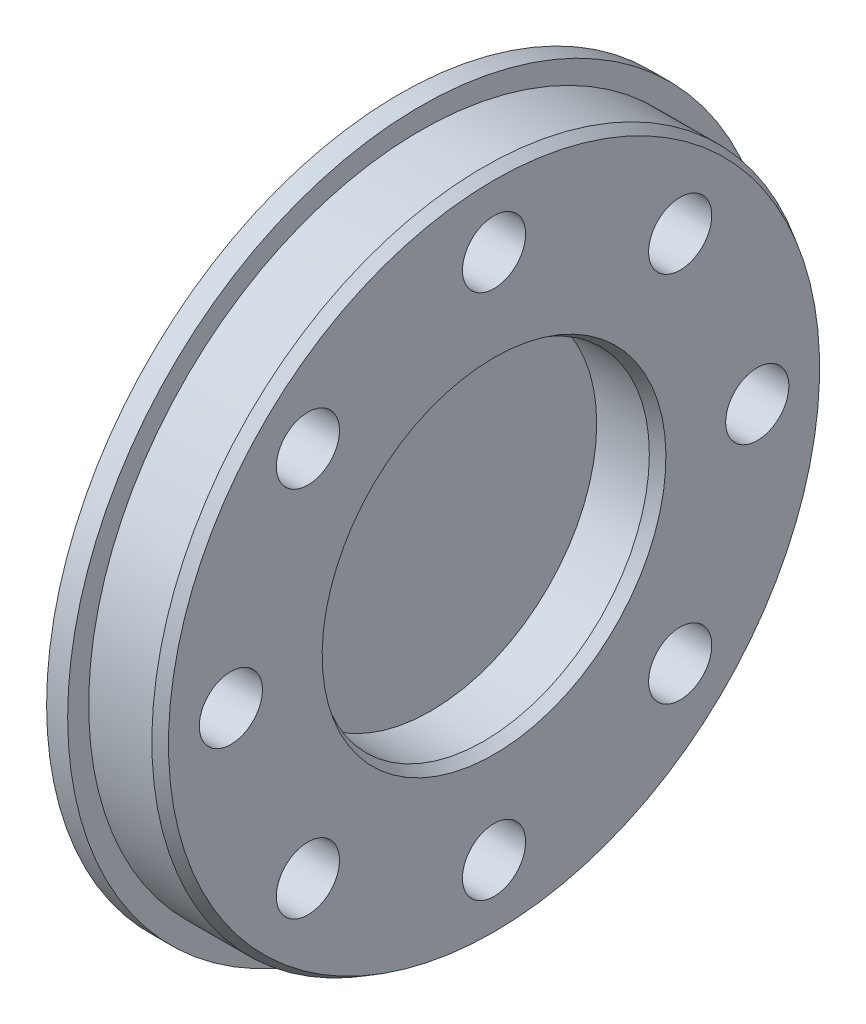
ISO-10303-21;
HEADER;
FILE_DESCRIPTION(('STEP AP214'),'2;1');
FILE_NAME('part.step','',(''),(''),'','','');
FILE_SCHEMA(('AUTOMOTIVE_DESIGN { 1 0 10303 214 1 1 1 1 }'));
ENDSEC;
DATA;
#1=APPLICATION_CONTEXT('core data for automotive mechanical design processes');
#2=APPLICATION_PROTOCOL_DEFINITION('international standard','automotive_design',2000,#1);
#3=PRODUCT_CONTEXT('',#1,'mechanical');
#4=PRODUCT('Part','Part','',(#3));
#5=PRODUCT_RELATED_PRODUCT_CATEGORY('part','',(#4));
#6=PRODUCT_DEFINITION_FORMATION('','',#4);
#7=PRODUCT_DEFINITION_CONTEXT('part definition',#1,'design');
#8=PRODUCT_DEFINITION('design','',#6,#7);
#9=PRODUCT_DEFINITION_SHAPE('','',#8);
#10=(LENGTH_UNIT() NAMED_UNIT(*) SI_UNIT(.MILLI.,.METRE.));
#11=(NAMED_UNIT(*) PLANE_ANGLE_UNIT() SI_UNIT($,.RADIAN.));
#12=(NAMED_UNIT(*) SI_UNIT($,.STERADIAN.) SOLID_ANGLE_UNIT());
#13=UNCERTAINTY_MEASURE_WITH_UNIT(LENGTH_MEASURE(1.E-05),#10,'distance_accuracy_value','');
#14=(GEOMETRIC_REPRESENTATION_CONTEXT(3) GLOBAL_UNCERTAINTY_ASSIGNED_CONTEXT((#13)) GLOBAL_UNIT_ASSIGNED_CONTEXT((#10,
#11,#12)) REPRESENTATION_CONTEXT('',''));
#15=CARTESIAN_POINT('',(0.,0.,0.));
#16=DIRECTION('',(0.,0.,1.));
#17=DIRECTION('',(1.,0.,0.));
#18=AXIS2_PLACEMENT_3D('',#15,#16,#17);
#19=CARTESIAN_POINT('',(962.000003067001,-3.22883386694173E-12,1450.));
#20=DIRECTION('',(-1.,0.,0.));
#21=DIRECTION('',(0.,0.,1.));
#22=AXIS2_PLACEMENT_3D('',#19,#20,#21);
#23=PLANE('',#22);
#24=CARTESIAN_POINT('',(962.000003067001,-3.22883386694173E-12,1450.));
#25=DIRECTION('',(-1.,0.,0.));
#26=DIRECTION('',(0.,0.,1.));
#27=AXIS2_PLACEMENT_3D('',#24,#25,#26);
#28=CIRCLE('',#27,15.75);
#29=CARTESIAN_POINT('',(962.000003067001,-3.22883386694173E-12,1465.75));
#30=VERTEX_POINT('',#29);
#31=EDGE_CURVE('E18',#30,#30,#28,.F.);
#32=ORIENTED_EDGE('',*,*,#31,.T.);
#33=EDGE_LOOP('',(#32));
#34=FACE_BOUND('',#33,.T.);
#35=ADVANCED_FACE('F15',(#34),#23,.F.);
#36=CARTESIAN_POINT('',(968.000003067001,-3.22883386694173E-12,1450.));
#37=DIRECTION('',(-1.,0.,0.));
#38=DIRECTION('',(0.,0.,1.));
#39=AXIS2_PLACEMENT_3D('',#36,#37,#38);
#40=CYLINDRICAL_SURFACE('',#39,15.75);
#41=ORIENTED_EDGE('',*,*,#31,.F.);
#42=EDGE_LOOP('',(#41));
#43=FACE_BOUND('',#42,.T.);
#44=CARTESIAN_POINT('',(967.000003066655,-3.22883386694173E-12,1450.));
#45=DIRECTION('',(1.,0.,0.));
#46=DIRECTION('',(0.,0.,-1.));
#47=AXIS2_PLACEMENT_3D('',#44,#45,#46);
#48=CIRCLE('',#47,15.7500000005983);
#49=CARTESIAN_POINT('',(967.000003066655,-3.22883386694173E-12,1434.2499999994));
#50=VERTEX_POINT('',#49);
#51=EDGE_CURVE('E94',#50,#50,#48,.T.);
#52=ORIENTED_EDGE('',*,*,#51,.T.);
#53=EDGE_LOOP('',(#52));
#54=FACE_BOUND('',#53,.T.);
#55=ADVANCED_FACE('F108',(#43,#54),#40,.F.);
#56=CARTESIAN_POINT('',(962.000003067001,-3.22883386694173E-12,1475.));
#57=DIRECTION('',(-1.,0.,0.));
#58=DIRECTION('',(0.,0.,1.));
#59=AXIS2_PLACEMENT_3D('',#56,#57,#58);
#60=PLANE('',#59);
#61=CARTESIAN_POINT('',(962.000003067001,-3.22883386694173E-12,1475.));
#62=DIRECTION('',(-1.,0.,0.));
#63=DIRECTION('',(0.,0.,1.));
#64=AXIS2_PLACEMENT_3D('',#61,#62,#63);
#65=CIRCLE('',#64,3.);
#66=CARTESIAN_POINT('',(962.000003067001,-3.22883386694173E-12,1478.));
#67=VERTEX_POINT('',#66);
#68=EDGE_CURVE('E92',#67,#67,#65,.F.);
#69=ORIENTED_EDGE('',*,*,#68,.T.);
#70=EDGE_LOOP('',(#69));
#71=FACE_BOUND('',#70,.T.);
#72=ADVANCED_FACE('F110',(#71),#60,.F.);
#73=CARTESIAN_POINT('',(967.000003066656,-3.22883386694173E-12,1450.));
#74=DIRECTION('',(-1.,0.,0.));
#75=DIRECTION('',(0.,-1.,0.));
#76=AXIS2_PLACEMENT_3D('',#73,#74,#75);
#77=CONICAL_SURFACE('',#76,31.4999999994017,0.523598774999894);
#78=CARTESIAN_POINT('',(968.000003067001,-3.22707160817184E-12,1450.));
#79=DIRECTION('',(-1.,0.,0.));
#80=DIRECTION('',(0.,-1.,0.));
#81=AXIS2_PLACEMENT_3D('',#78,#79,#80);
#82=CIRCLE('',#81,30.9226497308104);
#83=CARTESIAN_POINT('',(968.000003067001,-30.9226497308136,1450.));
#84=VERTEX_POINT('',#83);
#85=EDGE_CURVE('E89',#84,#84,#82,.F.);
#86=ORIENTED_EDGE('',*,*,#85,.F.);
#87=EDGE_LOOP('',(#86));
#88=FACE_BOUND('',#87,.T.);
#89=CARTESIAN_POINT('',(967.000003067001,-3.22883386694173E-12,1450.));
#90=DIRECTION('',(1.,0.,0.));
#91=DIRECTION('',(0.,0.,-1.));
#92=AXIS2_PLACEMENT_3D('',#89,#90,#91);
#93=CIRCLE('',#92,31.5);
#94=CARTESIAN_POINT('',(967.000003067001,-3.22883386694173E-12,1418.5));
#95=VERTEX_POINT('',#94);
#96=EDGE_CURVE('E91',#95,#95,#93,.F.);
#97=ORIENTED_EDGE('',*,*,#96,.F.);
#98=EDGE_LOOP('',(#97));
#99=FACE_BOUND('',#98,.T.);
#100=ADVANCED_FACE('F116',(#88,#99),#77,.T.);
#101=CARTESIAN_POINT('',(968.000003067001,-3.22883386694173E-12,1450.));
#102=DIRECTION('',(1.,0.,0.));
#103=DIRECTION('',(0.,1.,0.));
#104=AXIS2_PLACEMENT_3D('',#101,#102,#103);
#105=CONICAL_SURFACE('',#104,16.3273502691896,0.523598774999894);
#106=CARTESIAN_POINT('',(968.000003067001,-3.22883386694173E-12,1450.));
#107=DIRECTION('',(1.,0.,0.));
#108=DIRECTION('',(0.,1.,0.));
#109=AXIS2_PLACEMENT_3D('',#106,#107,#108);
#110=CIRCLE('',#109,16.3273502691896);
#111=CARTESIAN_POINT('',(968.000003067001,16.3273502691864,1450.));
#112=VERTEX_POINT('',#111);
#113=EDGE_CURVE('E86',#112,#112,#110,.F.);
#114=ORIENTED_EDGE('',*,*,#113,.F.);
#115=EDGE_LOOP('',(#114));
#116=FACE_BOUND('',#115,.T.);
#117=ORIENTED_EDGE('',*,*,#51,.F.);
#118=EDGE_LOOP('',(#117));
#119=FACE_BOUND('',#118,.T.);
#120=ADVANCED_FACE('F180',(#116,#119),#105,.F.);
#121=CARTESIAN_POINT('',(968.000003067001,-3.22883386694173E-12,1475.));
#122=DIRECTION('',(-1.,0.,0.));
#123=DIRECTION('',(0.,0.,1.));
#124=AXIS2_PLACEMENT_3D('',#121,#122,#123);
#125=CYLINDRICAL_SURFACE('',#124,3.);
#126=CARTESIAN_POINT('',(968.000003067001,-3.22883386694173E-12,1475.));
#127=DIRECTION('',(-1.,0.,0.));
#128=DIRECTION('',(0.,0.,1.));
#129=AXIS2_PLACEMENT_3D('',#126,#127,#128);
#130=CIRCLE('',#129,3.);
#131=CARTESIAN_POINT('',(968.000003067001,-3.22883386694173E-12,1478.));
#132=VERTEX_POINT('',#131);
#133=EDGE_CURVE('E83',#132,#132,#130,.T.);
#134=ORIENTED_EDGE('',*,*,#133,.F.);
#135=EDGE_LOOP('',(#134));
#136=FACE_BOUND('',#135,.T.);
#137=ORIENTED_EDGE('',*,*,#68,.F.);
#138=EDGE_LOOP('',(#137));
#139=FACE_BOUND('',#138,.T.);
#140=ADVANCED_FACE('F176',(#136,#139),#125,.F.);
#141=CARTESIAN_POINT('',(961.000003067001,-3.22883386694173E-12,1450.));
#142=DIRECTION('',(1.,0.,0.));
#143=DIRECTION('',(0.,0.,-1.));
#144=AXIS2_PLACEMENT_3D('',#141,#142,#143);
#145=CYLINDRICAL_SURFACE('',#144,31.5);
#146=CARTESIAN_POINT('',(961.000003067001,-3.22883386694173E-12,1450.));
#147=DIRECTION('',(1.,0.,0.));
#148=DIRECTION('',(0.,0.,-1.));
#149=AXIS2_PLACEMENT_3D('',#146,#147,#148);
#150=CIRCLE('',#149,31.5);
#151=CARTESIAN_POINT('',(961.000003067001,-3.22883386694173E-12,1418.5));
#152=VERTEX_POINT('',#151);
#153=EDGE_CURVE('E80',#152,#152,#150,.F.);
#154=ORIENTED_EDGE('',*,*,#153,.F.);
#155=EDGE_LOOP('',(#154));
#156=FACE_BOUND('',#155,.T.);
#157=ORIENTED_EDGE('',*,*,#96,.T.);
#158=EDGE_LOOP('',(#157));
#159=FACE_BOUND('',#158,.T.);
#160=ADVANCED_FACE('F172',(#156,#159),#145,.T.);
#161=CARTESIAN_POINT('',(954.000003067001,-3.22146129216883E-12,1450.));
#162=DIRECTION('',(-1.,0.,0.));
#163=DIRECTION('',(0.,0.,1.));
#164=AXIS2_PLACEMENT_3D('',#161,#162,#163);
#165=PLANE('',#164);
#166=CARTESIAN_POINT('',(954.000003067001,-3.22146129216883E-12,1450.));
#167=DIRECTION('',(-1.,0.,0.));
#168=DIRECTION('',(0.,0.,1.));
#169=AXIS2_PLACEMENT_3D('',#166,#167,#168);
#170=CIRCLE('',#169,15.);
#171=CARTESIAN_POINT('',(954.000003067001,-3.22146129216883E-12,1465.));
#172=VERTEX_POINT('',#171);
#173=EDGE_CURVE('E77',#172,#172,#170,.F.);
#174=ORIENTED_EDGE('',*,*,#173,.F.);
#175=EDGE_LOOP('',(#174));
#176=FACE_BOUND('',#175,.T.);
#177=ADVANCED_FACE('F168',(#176),#165,.T.);
#178=CARTESIAN_POINT('',(968.000003067001,-3.22883386694173E-12,1450.));
#179=DIRECTION('',(1.,0.,0.));
#180=DIRECTION('',(0.,0.,-1.));
#181=AXIS2_PLACEMENT_3D('',#178,#179,#180);
#182=PLANE('',#181);
#183=ORIENTED_EDGE('',*,*,#133,.T.);
#184=EDGE_LOOP('',(#183));
#185=FACE_BOUND('',#184,.T.);
#186=CARTESIAN_POINT('',(968.000003067001,17.6776695296604,1467.67766952966));
#187=DIRECTION('',(-1.,0.,0.));
#188=DIRECTION('',(0.,0.,1.));
#189=AXIS2_PLACEMENT_3D('',#186,#187,#188);
#190=CIRCLE('',#189,3.);
#191=CARTESIAN_POINT('',(968.000003067001,17.6776695296604,1470.67766952966));
#192=VERTEX_POINT('',#191);
#193=EDGE_CURVE('E56',#192,#192,#190,.T.);
#194=ORIENTED_EDGE('',*,*,#193,.T.);
#195=EDGE_LOOP('',(#194));
#196=FACE_BOUND('',#195,.T.);
#197=CARTESIAN_POINT('',(968.000003067001,-25.0000000000032,1450.));
#198=DIRECTION('',(-1.,0.,0.));
#199=DIRECTION('',(0.,0.,1.));
#200=AXIS2_PLACEMENT_3D('',#197,#198,#199);
#201=CIRCLE('',#200,3.);
#202=CARTESIAN_POINT('',(968.000003067001,-25.0000000000032,1453.));
#203=VERTEX_POINT('',#202);
#204=EDGE_CURVE('E59',#203,#203,#201,.T.);
#205=ORIENTED_EDGE('',*,*,#204,.T.);
#206=EDGE_LOOP('',(#205));
#207=FACE_BOUND('',#206,.T.);
#208=CARTESIAN_POINT('',(968.000003067001,-17.6776695296669,1432.32233047033));
#209=DIRECTION('',(-1.,0.,0.));
#210=DIRECTION('',(0.,0.,1.));
#211=AXIS2_PLACEMENT_3D('',#208,#209,#210);
#212=CIRCLE('',#211,3.);
#213=CARTESIAN_POINT('',(968.000003067001,-17.6776695296669,1435.32233047033));
#214=VERTEX_POINT('',#213);
#215=EDGE_CURVE('E62',#214,#214,#212,.T.);
#216=ORIENTED_EDGE('',*,*,#215,.T.);
#217=EDGE_LOOP('',(#216));
#218=FACE_BOUND('',#217,.T.);
#219=CARTESIAN_POINT('',(968.000003067001,-17.6776695296669,1467.67766952966));
#220=DIRECTION('',(-1.,0.,0.));
#221=DIRECTION('',(0.,0.,1.));
#222=AXIS2_PLACEMENT_3D('',#219,#220,#221);
#223=CIRCLE('',#222,3.);
#224=CARTESIAN_POINT('',(968.000003067001,-17.6776695296669,1470.67766952966));
#225=VERTEX_POINT('',#224);
#226=EDGE_CURVE('E65',#225,#225,#223,.T.);
#227=ORIENTED_EDGE('',*,*,#226,.T.);
#228=EDGE_LOOP('',(#227));
#229=FACE_BOUND('',#228,.T.);
#230=CARTESIAN_POINT('',(968.000003067001,-3.17838351628795E-12,1425.));
#231=DIRECTION('',(-1.,0.,0.));
#232=DIRECTION('',(0.,0.,1.));
#233=AXIS2_PLACEMENT_3D('',#230,#231,#232);
#234=CIRCLE('',#233,3.);
#235=CARTESIAN_POINT('',(968.000003067001,-3.17838351628795E-12,1428.));
#236=VERTEX_POINT('',#235);
#237=EDGE_CURVE('E68',#236,#236,#234,.T.);
#238=ORIENTED_EDGE('',*,*,#237,.T.);
#239=EDGE_LOOP('',(#238));
#240=FACE_BOUND('',#239,.T.);
#241=CARTESIAN_POINT('',(968.000003067001,17.6776695296605,1432.32233047033));
#242=DIRECTION('',(-1.,0.,0.));
#243=DIRECTION('',(0.,0.,1.));
#244=AXIS2_PLACEMENT_3D('',#241,#242,#243);
#245=CIRCLE('',#244,3.);
#246=CARTESIAN_POINT('',(968.000003067001,17.6776695296605,1435.32233047033));
#247=VERTEX_POINT('',#246);
#248=EDGE_CURVE('E71',#247,#247,#245,.T.);
#249=ORIENTED_EDGE('',*,*,#248,.T.);
#250=EDGE_LOOP('',(#249));
#251=FACE_BOUND('',#250,.T.);
#252=CARTESIAN_POINT('',(968.000003067001,24.9999999999968,1450.));
#253=DIRECTION('',(-1.,0.,0.));
#254=DIRECTION('',(0.,0.,1.));
#255=AXIS2_PLACEMENT_3D('',#252,#253,#254);
#256=CIRCLE('',#255,3.);
#257=CARTESIAN_POINT('',(968.000003067001,24.9999999999968,1453.));
#258=VERTEX_POINT('',#257);
#259=EDGE_CURVE('E74',#258,#258,#256,.T.);
#260=ORIENTED_EDGE('',*,*,#259,.T.);
#261=EDGE_LOOP('',(#260));
#262=FACE_BOUND('',#261,.T.);
#263=ORIENTED_EDGE('',*,*,#113,.T.);
#264=EDGE_LOOP('',(#263));
#265=FACE_BOUND('',#264,.T.);
#266=ORIENTED_EDGE('',*,*,#85,.T.);
#267=EDGE_LOOP('',(#266));
#268=FACE_BOUND('',#267,.T.);
#269=ADVANCED_FACE('F164',(#185,#196,#207,#218,#229,#240,#251,#262,#265,#268),#182,.T.);
#270=CARTESIAN_POINT('',(961.000003067001,-3.22189497303782E-12,1450.));
#271=DIRECTION('',(1.,0.,0.));
#272=DIRECTION('',(0.,0.,-1.));
#273=AXIS2_PLACEMENT_3D('',#270,#271,#272);
#274=PLANE('',#273);
#275=CARTESIAN_POINT('',(961.000003067001,-3.22189497303782E-12,1450.));
#276=DIRECTION('',(-1.,0.,0.));
#277=DIRECTION('',(0.,0.,1.));
#278=AXIS2_PLACEMENT_3D('',#275,#276,#277);
#279=CIRCLE('',#278,33.5);
#280=CARTESIAN_POINT('',(961.000003067001,-3.22189497303782E-12,1483.5));
#281=VERTEX_POINT('',#280);
#282=EDGE_CURVE('E53',#281,#281,#279,.T.);
#283=ORIENTED_EDGE('',*,*,#282,.F.);
#284=EDGE_LOOP('',(#283));
#285=FACE_BOUND('',#284,.T.);
#286=ORIENTED_EDGE('',*,*,#153,.T.);
#287=EDGE_LOOP('',(#286));
#288=FACE_BOUND('',#287,.T.);
#289=ADVANCED_FACE('F160',(#285,#288),#274,.T.);
#290=CARTESIAN_POINT('',(959.000003067001,-3.22146129216883E-12,1450.));
#291=DIRECTION('',(-1.,0.,0.));
#292=DIRECTION('',(0.,0.,1.));
#293=AXIS2_PLACEMENT_3D('',#290,#291,#292);
#294=CYLINDRICAL_SURFACE('',#293,15.);
#295=CARTESIAN_POINT('',(959.000003067001,-3.22146129216883E-12,1450.));
#296=DIRECTION('',(-1.,0.,0.));
#297=DIRECTION('',(0.,0.,1.));
#298=AXIS2_PLACEMENT_3D('',#295,#296,#297);
#299=CIRCLE('',#298,15.);
#300=CARTESIAN_POINT('',(959.000003067001,-3.22146129216883E-12,1465.));
#301=VERTEX_POINT('',#300);
#302=EDGE_CURVE('E50',#301,#301,#299,.T.);
#303=ORIENTED_EDGE('',*,*,#302,.T.);
#304=EDGE_LOOP('',(#303));
#305=FACE_BOUND('',#304,.T.);
#306=ORIENTED_EDGE('',*,*,#173,.T.);
#307=EDGE_LOOP('',(#306));
#308=FACE_BOUND('',#307,.T.);
#309=ADVANCED_FACE('F156',(#305,#308),#294,.T.);
#310=CARTESIAN_POINT('',(968.000003067001,24.9999999999968,1450.));
#311=DIRECTION('',(-1.,0.,0.));
#312=DIRECTION('',(0.,0.,1.));
#313=AXIS2_PLACEMENT_3D('',#310,#311,#312);
#314=CYLINDRICAL_SURFACE('',#313,3.);
#315=CARTESIAN_POINT('',(959.000003067001,24.9999999999968,1450.));
#316=DIRECTION('',(-1.,0.,0.));
#317=DIRECTION('',(0.,0.,1.));
#318=AXIS2_PLACEMENT_3D('',#315,#316,#317);
#319=CIRCLE('',#318,3.);
#320=CARTESIAN_POINT('',(959.000003067001,24.9999999999968,1453.));
#321=VERTEX_POINT('',#320);
#322=EDGE_CURVE('E47',#321,#321,#319,.T.);
#323=ORIENTED_EDGE('',*,*,#322,.T.);
#324=EDGE_LOOP('',(#323));
#325=FACE_BOUND('',#324,.T.);
#326=ORIENTED_EDGE('',*,*,#259,.F.);
#327=EDGE_LOOP('',(#326));
#328=FACE_BOUND('',#327,.T.);
#329=ADVANCED_FACE('F152',(#325,#328),#314,.F.);
#330=CARTESIAN_POINT('',(968.000003067001,17.6776695296605,1432.32233047033));
#331=DIRECTION('',(-1.,0.,0.));
#332=DIRECTION('',(0.,0.,1.));
#333=AXIS2_PLACEMENT_3D('',#330,#331,#332);
#334=CYLINDRICAL_SURFACE('',#333,3.);
#335=CARTESIAN_POINT('',(959.000003067001,17.6776695296605,1432.32233047033));
#336=DIRECTION('',(-1.,0.,0.));
#337=DIRECTION('',(0.,0.,1.));
#338=AXIS2_PLACEMENT_3D('',#335,#336,#337);
#339=CIRCLE('',#338,3.);
#340=CARTESIAN_POINT('',(959.000003067001,17.6776695296605,1435.32233047033));
#341=VERTEX_POINT('',#340);
#342=EDGE_CURVE('E44',#341,#341,#339,.T.);
#343=ORIENTED_EDGE('',*,*,#342,.T.);
#344=EDGE_LOOP('',(#343));
#345=FACE_BOUND('',#344,.T.);
#346=ORIENTED_EDGE('',*,*,#248,.F.);
#347=EDGE_LOOP('',(#346));
#348=FACE_BOUND('',#347,.T.);
#349=ADVANCED_FACE('F148',(#345,#348),#334,.F.);
#350=CARTESIAN_POINT('',(968.000003067001,-3.17838351628795E-12,1425.));
#351=DIRECTION('',(-1.,0.,0.));
#352=DIRECTION('',(0.,0.,1.));
#353=AXIS2_PLACEMENT_3D('',#350,#351,#352);
#354=CYLINDRICAL_SURFACE('',#353,3.);
#355=CARTESIAN_POINT('',(959.000003067001,-3.17838351628795E-12,1425.));
#356=DIRECTION('',(-1.,0.,0.));
#357=DIRECTION('',(0.,0.,1.));
#358=AXIS2_PLACEMENT_3D('',#355,#356,#357);
#359=CIRCLE('',#358,3.);
#360=CARTESIAN_POINT('',(959.000003067001,-3.17838351628795E-12,1428.));
#361=VERTEX_POINT('',#360);
#362=EDGE_CURVE('E41',#361,#361,#359,.T.);
#363=ORIENTED_EDGE('',*,*,#362,.T.);
#364=EDGE_LOOP('',(#363));
#365=FACE_BOUND('',#364,.T.);
#366=ORIENTED_EDGE('',*,*,#237,.F.);
#367=EDGE_LOOP('',(#366));
#368=FACE_BOUND('',#367,.T.);
#369=ADVANCED_FACE('F144',(#365,#368),#354,.F.);
#370=CARTESIAN_POINT('',(968.000003067001,-17.6776695296669,1467.67766952966));
#371=DIRECTION('',(-1.,0.,0.));
#372=DIRECTION('',(0.,0.,1.));
#373=AXIS2_PLACEMENT_3D('',#370,#371,#372);
#374=CYLINDRICAL_SURFACE('',#373,3.);
#375=CARTESIAN_POINT('',(959.000003067001,-17.6776695296669,1467.67766952966));
#376=DIRECTION('',(-1.,0.,0.));
#377=DIRECTION('',(0.,0.,1.));
#378=AXIS2_PLACEMENT_3D('',#375,#376,#377);
#379=CIRCLE('',#378,3.);
#380=CARTESIAN_POINT('',(959.000003067001,-17.6776695296669,1470.67766952966));
#381=VERTEX_POINT('',#380);
#382=EDGE_CURVE('E38',#381,#381,#379,.T.);
#383=ORIENTED_EDGE('',*,*,#382,.T.);
#384=EDGE_LOOP('',(#383));
#385=FACE_BOUND('',#384,.T.);
#386=ORIENTED_EDGE('',*,*,#226,.F.);
#387=EDGE_LOOP('',(#386));
#388=FACE_BOUND('',#387,.T.);
#389=ADVANCED_FACE('F140',(#385,#388),#374,.F.);
#390=CARTESIAN_POINT('',(968.000003067001,-17.6776695296669,1432.32233047033));
#391=DIRECTION('',(-1.,0.,0.));
#392=DIRECTION('',(0.,0.,1.));
#393=AXIS2_PLACEMENT_3D('',#390,#391,#392);
#394=CYLINDRICAL_SURFACE('',#393,3.);
#395=CARTESIAN_POINT('',(959.000003067001,-17.6776695296669,1432.32233047033));
#396=DIRECTION('',(-1.,0.,0.));
#397=DIRECTION('',(0.,0.,1.));
#398=AXIS2_PLACEMENT_3D('',#395,#396,#397);
#399=CIRCLE('',#398,3.);
#400=CARTESIAN_POINT('',(959.000003067001,-17.6776695296669,1435.32233047033));
#401=VERTEX_POINT('',#400);
#402=EDGE_CURVE('E35',#401,#401,#399,.T.);
#403=ORIENTED_EDGE('',*,*,#402,.T.);
#404=EDGE_LOOP('',(#403));
#405=FACE_BOUND('',#404,.T.);
#406=ORIENTED_EDGE('',*,*,#215,.F.);
#407=EDGE_LOOP('',(#406));
#408=FACE_BOUND('',#407,.T.);
#409=ADVANCED_FACE('F136',(#405,#408),#394,.F.);
#410=CARTESIAN_POINT('',(968.000003067001,-25.0000000000032,1450.));
#411=DIRECTION('',(-1.,0.,0.));
#412=DIRECTION('',(0.,0.,1.));
#413=AXIS2_PLACEMENT_3D('',#410,#411,#412);
#414=CYLINDRICAL_SURFACE('',#413,3.);
#415=CARTESIAN_POINT('',(959.000003067001,-25.0000000000032,1450.));
#416=DIRECTION('',(-1.,0.,0.));
#417=DIRECTION('',(0.,0.,1.));
#418=AXIS2_PLACEMENT_3D('',#415,#416,#417);
#419=CIRCLE('',#418,3.);
#420=CARTESIAN_POINT('',(959.000003067001,-25.0000000000032,1453.));
#421=VERTEX_POINT('',#420);
#422=EDGE_CURVE('E27',#421,#421,#419,.T.);
#423=ORIENTED_EDGE('',*,*,#422,.T.);
#424=EDGE_LOOP('',(#423));
#425=FACE_BOUND('',#424,.T.);
#426=ORIENTED_EDGE('',*,*,#204,.F.);
#427=EDGE_LOOP('',(#426));
#428=FACE_BOUND('',#427,.T.);
#429=ADVANCED_FACE('F132',(#425,#428),#414,.F.);
#430=CARTESIAN_POINT('',(968.000003067001,17.6776695296604,1467.67766952966));
#431=DIRECTION('',(-1.,0.,0.));
#432=DIRECTION('',(0.,0.,1.));
#433=AXIS2_PLACEMENT_3D('',#430,#431,#432);
#434=CYLINDRICAL_SURFACE('',#433,3.);
#435=CARTESIAN_POINT('',(959.000003067001,17.6776695296604,1467.67766952966));
#436=DIRECTION('',(-1.,0.,0.));
#437=DIRECTION('',(0.,0.,1.));
#438=AXIS2_PLACEMENT_3D('',#435,#436,#437);
#439=CIRCLE('',#438,3.);
#440=CARTESIAN_POINT('',(959.000003067001,17.6776695296604,1470.67766952966));
#441=VERTEX_POINT('',#440);
#442=EDGE_CURVE('E22',#441,#441,#439,.T.);
#443=ORIENTED_EDGE('',*,*,#442,.T.);
#444=EDGE_LOOP('',(#443));
#445=FACE_BOUND('',#444,.T.);
#446=ORIENTED_EDGE('',*,*,#193,.F.);
#447=EDGE_LOOP('',(#446));
#448=FACE_BOUND('',#447,.T.);
#449=ADVANCED_FACE('F126',(#445,#448),#434,.F.);
#450=CARTESIAN_POINT('',(961.000003067001,-3.22189497303782E-12,1450.));
#451=DIRECTION('',(-1.,0.,0.));
#452=DIRECTION('',(0.,0.,1.));
#453=AXIS2_PLACEMENT_3D('',#450,#451,#452);
#454=CYLINDRICAL_SURFACE('',#453,33.5);
#455=CARTESIAN_POINT('',(959.000003067001,-3.22189497303782E-12,1450.));
#456=DIRECTION('',(-1.,0.,0.));
#457=DIRECTION('',(0.,0.,1.));
#458=AXIS2_PLACEMENT_3D('',#455,#456,#457);
#459=CIRCLE('',#458,33.5);
#460=CARTESIAN_POINT('',(959.000003067001,-3.22189497303782E-12,1483.5));
#461=VERTEX_POINT('',#460);
#462=EDGE_CURVE('E10',#461,#461,#459,.F.);
#463=ORIENTED_EDGE('',*,*,#462,.T.);
#464=EDGE_LOOP('',(#463));
#465=FACE_BOUND('',#464,.T.);
#466=ORIENTED_EDGE('',*,*,#282,.T.);
#467=EDGE_LOOP('',(#466));
#468=FACE_BOUND('',#467,.T.);
#469=ADVANCED_FACE('F120',(#465,#468),#454,.T.);
#470=CARTESIAN_POINT('',(959.000003067001,-3.22189497303782E-12,1450.));
#471=DIRECTION('',(1.,0.,0.));
#472=DIRECTION('',(0.,0.,-1.));
#473=AXIS2_PLACEMENT_3D('',#470,#471,#472);
#474=PLANE('',#473);
#475=ORIENTED_EDGE('',*,*,#462,.F.);
#476=EDGE_LOOP('',(#475));
#477=FACE_BOUND('',#476,.T.);
#478=ORIENTED_EDGE('',*,*,#442,.F.);
#479=EDGE_LOOP('',(#478));
#480=FACE_BOUND('',#479,.T.);
#481=ORIENTED_EDGE('',*,*,#422,.F.);
#482=EDGE_LOOP('',(#481));
#483=FACE_BOUND('',#482,.T.);
#484=ORIENTED_EDGE('',*,*,#402,.F.);
#485=EDGE_LOOP('',(#484));
#486=FACE_BOUND('',#485,.T.);
#487=ORIENTED_EDGE('',*,*,#382,.F.);
#488=EDGE_LOOP('',(#487));
#489=FACE_BOUND('',#488,.T.);
#490=ORIENTED_EDGE('',*,*,#362,.F.);
#491=EDGE_LOOP('',(#490));
#492=FACE_BOUND('',#491,.T.);
#493=ORIENTED_EDGE('',*,*,#342,.F.);
#494=EDGE_LOOP('',(#493));
#495=FACE_BOUND('',#494,.T.);
#496=ORIENTED_EDGE('',*,*,#322,.F.);
#497=EDGE_LOOP('',(#496));
#498=FACE_BOUND('',#497,.T.);
#499=ORIENTED_EDGE('',*,*,#302,.F.);
#500=EDGE_LOOP('',(#499));
#501=FACE_BOUND('',#500,.T.);
#502=ADVANCED_FACE('F118',(#477,#480,#483,#486,#489,#492,#495,#498,#501),#474,.F.);
#503=CLOSED_SHELL('',(#35,#55,#72,#100,#120,#140,#160,#177,#269,#289,#309,#329,#349,#369,#389,
#409,#429,#449,#469,#502));
#504=MANIFOLD_SOLID_BREP('B1',#503);
#505=ADVANCED_BREP_SHAPE_REPRESENTATION('',(#18,#504),#14);
#506=SHAPE_DEFINITION_REPRESENTATION(#9,#505);
ENDSEC;
END-ISO-10303-21;
